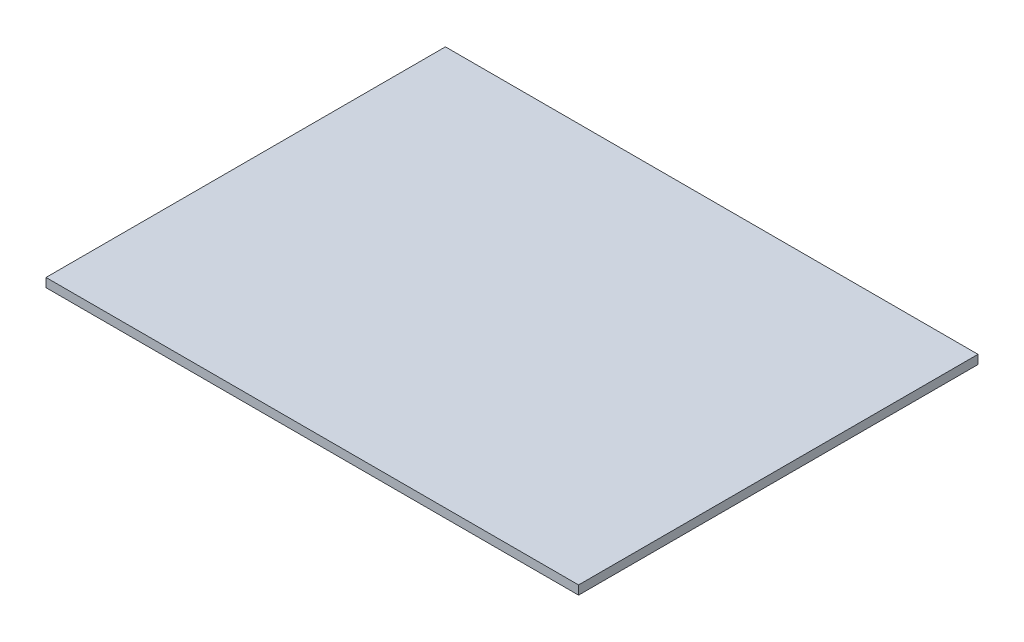
ISO-10303-21;
HEADER;
FILE_DESCRIPTION(('STEP AP214'),'2;1');
FILE_NAME('part.step','',(''),(''),'','','');
FILE_SCHEMA(('AUTOMOTIVE_DESIGN { 1 0 10303 214 1 1 1 1 }'));
ENDSEC;
DATA;
#1=APPLICATION_CONTEXT('core data for automotive mechanical design processes');
#2=APPLICATION_PROTOCOL_DEFINITION('international standard','automotive_design',2000,#1);
#3=PRODUCT_CONTEXT('',#1,'mechanical');
#4=PRODUCT('Part','Part','',(#3));
#5=PRODUCT_RELATED_PRODUCT_CATEGORY('part','',(#4));
#6=PRODUCT_DEFINITION_FORMATION('','',#4);
#7=PRODUCT_DEFINITION_CONTEXT('part definition',#1,'design');
#8=PRODUCT_DEFINITION('design','',#6,#7);
#9=PRODUCT_DEFINITION_SHAPE('','',#8);
#10=(LENGTH_UNIT() NAMED_UNIT(*) SI_UNIT(.MILLI.,.METRE.));
#11=(NAMED_UNIT(*) PLANE_ANGLE_UNIT() SI_UNIT($,.RADIAN.));
#12=(NAMED_UNIT(*) SI_UNIT($,.STERADIAN.) SOLID_ANGLE_UNIT());
#13=UNCERTAINTY_MEASURE_WITH_UNIT(LENGTH_MEASURE(1.E-05),#10,'distance_accuracy_value','');
#14=(GEOMETRIC_REPRESENTATION_CONTEXT(3) GLOBAL_UNCERTAINTY_ASSIGNED_CONTEXT((#13)) GLOBAL_UNIT_ASSIGNED_CONTEXT((#10,
#11,#12)) REPRESENTATION_CONTEXT('',''));
#15=CARTESIAN_POINT('',(0.,0.,0.));
#16=DIRECTION('',(0.,0.,1.));
#17=DIRECTION('',(1.,0.,0.));
#18=AXIS2_PLACEMENT_3D('',#15,#16,#17);
#19=CARTESIAN_POINT('',(60.,2.,-45.));
#20=DIRECTION('',(-1.,0.,0.));
#21=DIRECTION('',(0.,0.,1.));
#22=AXIS2_PLACEMENT_3D('',#19,#20,#21);
#23=PLANE('',#22);
#24=DIRECTION('',(0.,0.,-1.));
#25=VECTOR('',#24,1.);
#26=CARTESIAN_POINT('',(60.,0.,-45.));
#27=LINE('',#26,#25);
#28=CARTESIAN_POINT('',(60.,0.,45.));
#29=VERTEX_POINT('',#28);
#30=CARTESIAN_POINT('',(60.,0.,-45.));
#31=VERTEX_POINT('',#30);
#32=EDGE_CURVE('E107',#29,#31,#27,.T.);
#33=ORIENTED_EDGE('',*,*,#32,.T.);
#34=DIRECTION('',(0.,-1.,0.));
#35=VECTOR('',#34,1.);
#36=CARTESIAN_POINT('',(60.,2.,-45.));
#37=LINE('',#36,#35);
#38=CARTESIAN_POINT('',(60.,2.,-45.));
#39=VERTEX_POINT('',#38);
#40=EDGE_CURVE('E11',#39,#31,#37,.T.);
#41=ORIENTED_EDGE('',*,*,#40,.F.);
#42=DIRECTION('',(0.,0.,-1.));
#43=VECTOR('',#42,1.);
#44=CARTESIAN_POINT('',(60.,2.,-45.));
#45=LINE('',#44,#43);
#46=CARTESIAN_POINT('',(60.,2.,45.));
#47=VERTEX_POINT('',#46);
#48=EDGE_CURVE('E91',#47,#39,#45,.T.);
#49=ORIENTED_EDGE('',*,*,#48,.F.);
#50=DIRECTION('',(0.,-1.,0.));
#51=VECTOR('',#50,1.);
#52=CARTESIAN_POINT('',(60.,2.,45.));
#53=LINE('',#52,#51);
#54=EDGE_CURVE('E103',#47,#29,#53,.T.);
#55=ORIENTED_EDGE('',*,*,#54,.T.);
#56=EDGE_LOOP('',(#33,#41,#49,#55));
#57=FACE_BOUND('',#56,.T.);
#58=ADVANCED_FACE('F39',(#57),#23,.F.);
#59=CARTESIAN_POINT('',(-60.,2.,-45.));
#60=DIRECTION('',(0.,0.,1.));
#61=DIRECTION('',(1.,0.,0.));
#62=AXIS2_PLACEMENT_3D('',#59,#60,#61);
#63=PLANE('',#62);
#64=DIRECTION('',(-1.,0.,0.));
#65=VECTOR('',#64,1.);
#66=CARTESIAN_POINT('',(-60.,0.,-45.));
#67=LINE('',#66,#65);
#68=CARTESIAN_POINT('',(-60.,0.,-45.));
#69=VERTEX_POINT('',#68);
#70=EDGE_CURVE('E96',#31,#69,#67,.T.);
#71=ORIENTED_EDGE('',*,*,#70,.T.);
#72=DIRECTION('',(0.,-1.,0.));
#73=VECTOR('',#72,1.);
#74=CARTESIAN_POINT('',(-60.,2.,-45.));
#75=LINE('',#74,#73);
#76=CARTESIAN_POINT('',(-60.,2.,-45.));
#77=VERTEX_POINT('',#76);
#78=EDGE_CURVE('E48',#77,#69,#75,.T.);
#79=ORIENTED_EDGE('',*,*,#78,.F.);
#80=DIRECTION('',(-1.,0.,0.));
#81=VECTOR('',#80,1.);
#82=CARTESIAN_POINT('',(-60.,2.,-45.));
#83=LINE('',#82,#81);
#84=EDGE_CURVE('E86',#39,#77,#83,.T.);
#85=ORIENTED_EDGE('',*,*,#84,.F.);
#86=ORIENTED_EDGE('',*,*,#40,.T.);
#87=EDGE_LOOP('',(#71,#79,#85,#86));
#88=FACE_BOUND('',#87,.T.);
#89=ADVANCED_FACE('F95',(#88),#63,.F.);
#90=CARTESIAN_POINT('',(-60.,2.,-45.));
#91=DIRECTION('',(1.,0.,0.));
#92=DIRECTION('',(0.,0.,-1.));
#93=AXIS2_PLACEMENT_3D('',#90,#91,#92);
#94=PLANE('',#93);
#95=DIRECTION('',(0.,0.,1.));
#96=VECTOR('',#95,1.);
#97=CARTESIAN_POINT('',(-60.,0.,-45.));
#98=LINE('',#97,#96);
#99=CARTESIAN_POINT('',(-60.,0.,45.));
#100=VERTEX_POINT('',#99);
#101=EDGE_CURVE('E73',#69,#100,#98,.T.);
#102=ORIENTED_EDGE('',*,*,#101,.T.);
#103=DIRECTION('',(0.,-1.,0.));
#104=VECTOR('',#103,1.);
#105=CARTESIAN_POINT('',(-60.,2.,45.));
#106=LINE('',#105,#104);
#107=CARTESIAN_POINT('',(-60.,2.,45.));
#108=VERTEX_POINT('',#107);
#109=EDGE_CURVE('E98',#108,#100,#106,.T.);
#110=ORIENTED_EDGE('',*,*,#109,.F.);
#111=DIRECTION('',(0.,0.,1.));
#112=VECTOR('',#111,1.);
#113=CARTESIAN_POINT('',(-60.,2.,-45.));
#114=LINE('',#113,#112);
#115=EDGE_CURVE('E89',#77,#108,#114,.T.);
#116=ORIENTED_EDGE('',*,*,#115,.F.);
#117=ORIENTED_EDGE('',*,*,#78,.T.);
#118=EDGE_LOOP('',(#102,#110,#116,#117));
#119=FACE_BOUND('',#118,.T.);
#120=ADVANCED_FACE('F99',(#119),#94,.F.);
#121=CARTESIAN_POINT('',(-60.,2.,45.));
#122=DIRECTION('',(0.,0.,-1.));
#123=DIRECTION('',(-1.,0.,0.));
#124=AXIS2_PLACEMENT_3D('',#121,#122,#123);
#125=PLANE('',#124);
#126=DIRECTION('',(1.,0.,0.));
#127=VECTOR('',#126,1.);
#128=CARTESIAN_POINT('',(-60.,0.,45.));
#129=LINE('',#128,#127);
#130=EDGE_CURVE('E79',#100,#29,#129,.T.);
#131=ORIENTED_EDGE('',*,*,#130,.T.);
#132=ORIENTED_EDGE('',*,*,#54,.F.);
#133=DIRECTION('',(1.,0.,0.));
#134=VECTOR('',#133,1.);
#135=CARTESIAN_POINT('',(-60.,2.,45.));
#136=LINE('',#135,#134);
#137=EDGE_CURVE('E56',#108,#47,#136,.T.);
#138=ORIENTED_EDGE('',*,*,#137,.F.);
#139=ORIENTED_EDGE('',*,*,#109,.T.);
#140=EDGE_LOOP('',(#131,#132,#138,#139));
#141=FACE_BOUND('',#140,.T.);
#142=ADVANCED_FACE('F120',(#141),#125,.F.);
#143=CARTESIAN_POINT('',(0.,2.,0.));
#144=DIRECTION('',(0.,1.,0.));
#145=DIRECTION('',(0.,0.,1.));
#146=AXIS2_PLACEMENT_3D('',#143,#144,#145);
#147=PLANE('',#146);
#148=ORIENTED_EDGE('',*,*,#48,.T.);
#149=ORIENTED_EDGE('',*,*,#84,.T.);
#150=ORIENTED_EDGE('',*,*,#115,.T.);
#151=ORIENTED_EDGE('',*,*,#137,.T.);
#152=EDGE_LOOP('',(#148,#149,#150,#151));
#153=FACE_BOUND('',#152,.T.);
#154=ADVANCED_FACE('F87',(#153),#147,.T.);
#155=CARTESIAN_POINT('',(0.,0.,0.));
#156=DIRECTION('',(0.,1.,0.));
#157=DIRECTION('',(0.,0.,1.));
#158=AXIS2_PLACEMENT_3D('',#155,#156,#157);
#159=PLANE('',#158);
#160=ORIENTED_EDGE('',*,*,#32,.F.);
#161=ORIENTED_EDGE('',*,*,#130,.F.);
#162=ORIENTED_EDGE('',*,*,#101,.F.);
#163=ORIENTED_EDGE('',*,*,#70,.F.);
#164=EDGE_LOOP('',(#160,#161,#162,#163));
#165=FACE_BOUND('',#164,.T.);
#166=ADVANCED_FACE('F123',(#165),#159,.F.);
#167=CLOSED_SHELL('',(#58,#89,#120,#142,#154,#166));
#168=MANIFOLD_SOLID_BREP('B2',#167);
#169=ADVANCED_BREP_SHAPE_REPRESENTATION('',(#18,#168),#14);
#170=SHAPE_DEFINITION_REPRESENTATION(#9,#169);
ENDSEC;
END-ISO-10303-21;
